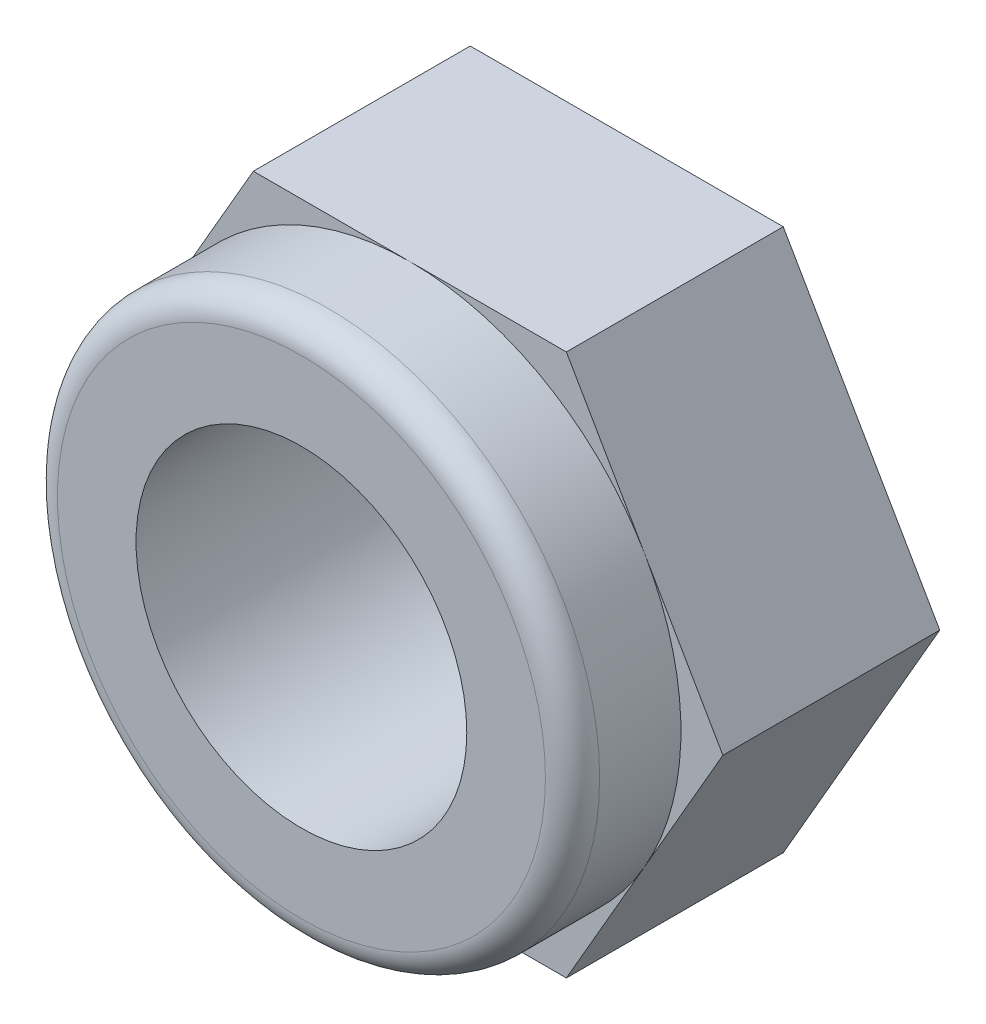
ISO-10303-21;
HEADER;
FILE_DESCRIPTION(('STEP AP214'),'2;1');
FILE_NAME('part.step','',(''),(''),'','','');
FILE_SCHEMA(('AUTOMOTIVE_DESIGN { 1 0 10303 214 1 1 1 1 }'));
ENDSEC;
DATA;
#1=APPLICATION_CONTEXT('core data for automotive mechanical design processes');
#2=APPLICATION_PROTOCOL_DEFINITION('international standard','automotive_design',2000,#1);
#3=PRODUCT_CONTEXT('',#1,'mechanical');
#4=PRODUCT('Part','Part','',(#3));
#5=PRODUCT_RELATED_PRODUCT_CATEGORY('part','',(#4));
#6=PRODUCT_DEFINITION_FORMATION('','',#4);
#7=PRODUCT_DEFINITION_CONTEXT('part definition',#1,'design');
#8=PRODUCT_DEFINITION('design','',#6,#7);
#9=PRODUCT_DEFINITION_SHAPE('','',#8);
#10=(LENGTH_UNIT() NAMED_UNIT(*) SI_UNIT(.MILLI.,.METRE.));
#11=(NAMED_UNIT(*) PLANE_ANGLE_UNIT() SI_UNIT($,.RADIAN.));
#12=(NAMED_UNIT(*) SI_UNIT($,.STERADIAN.) SOLID_ANGLE_UNIT());
#13=UNCERTAINTY_MEASURE_WITH_UNIT(LENGTH_MEASURE(1.E-05),#10,'distance_accuracy_value','');
#14=(GEOMETRIC_REPRESENTATION_CONTEXT(3) GLOBAL_UNCERTAINTY_ASSIGNED_CONTEXT((#13)) GLOBAL_UNIT_ASSIGNED_CONTEXT((#10,
#11,#12)) REPRESENTATION_CONTEXT('',''));
#15=CARTESIAN_POINT('',(0.,0.,0.));
#16=DIRECTION('',(0.,0.,1.));
#17=DIRECTION('',(1.,0.,0.));
#18=AXIS2_PLACEMENT_3D('',#15,#16,#17);
#19=CARTESIAN_POINT('',(0.,0.,4.));
#20=DIRECTION('',(0.,0.,1.));
#21=DIRECTION('',(1.,0.,0.));
#22=AXIS2_PLACEMENT_3D('',#19,#20,#21);
#23=PLANE('',#22);
#24=CARTESIAN_POINT('',(0.,-5.10000000000001,4.));
#25=DIRECTION('',(0.,0.,1.));
#26=DIRECTION('',(1.,0.,0.));
#27=AXIS2_PLACEMENT_3D('',#24,#25,#26);
#28=CIRCLE('',#27,5.);
#29=CARTESIAN_POINT('',(4.33012701892219,-2.60000000000001,4.));
#30=VERTEX_POINT('',#29);
#31=CARTESIAN_POINT('',(0.,-0.100000000000008,4.));
#32=VERTEX_POINT('',#31);
#33=EDGE_CURVE('E139',#30,#32,#28,.T.);
#34=ORIENTED_EDGE('',*,*,#33,.F.);
#35=DIRECTION('',(-0.5,0.866025403784438,0.));
#36=VECTOR('',#35,1.);
#37=CARTESIAN_POINT('',(5.77350269189626,-5.10000000000001,4.));
#38=LINE('',#37,#36);
#39=CARTESIAN_POINT('',(2.88675134594813,-0.100000000000007,4.));
#40=VERTEX_POINT('',#39);
#41=EDGE_CURVE('E127',#30,#40,#38,.T.);
#42=ORIENTED_EDGE('',*,*,#41,.T.);
#43=DIRECTION('',(-1.,0.,0.));
#44=VECTOR('',#43,1.);
#45=CARTESIAN_POINT('',(2.88675134594813,-0.100000000000007,4.));
#46=LINE('',#45,#44);
#47=EDGE_CURVE('E140',#40,#32,#46,.T.);
#48=ORIENTED_EDGE('',*,*,#47,.T.);
#49=EDGE_LOOP('',(#34,#42,#48));
#50=FACE_BOUND('',#49,.T.);
#51=ADVANCED_FACE('F36',(#50),#23,.T.);
#52=CARTESIAN_POINT('',(-4.33012701892219,-2.60000000000001,4.));
#53=VERTEX_POINT('',#52);
#54=EDGE_CURVE('E147',#32,#53,#28,.T.);
#55=ORIENTED_EDGE('',*,*,#54,.F.);
#56=CARTESIAN_POINT('',(-2.88675134594813,-0.100000000000008,4.));
#57=VERTEX_POINT('',#56);
#58=EDGE_CURVE('E167',#32,#57,#46,.T.);
#59=ORIENTED_EDGE('',*,*,#58,.T.);
#60=DIRECTION('',(-0.5,-0.866025403784439,0.));
#61=VECTOR('',#60,1.);
#62=CARTESIAN_POINT('',(-2.88675134594813,-0.100000000000008,4.));
#63=LINE('',#62,#61);
#64=EDGE_CURVE('E168',#57,#53,#63,.T.);
#65=ORIENTED_EDGE('',*,*,#64,.T.);
#66=EDGE_LOOP('',(#55,#59,#65));
#67=FACE_BOUND('',#66,.T.);
#68=ADVANCED_FACE('F271',(#67),#23,.T.);
#69=CARTESIAN_POINT('',(-4.33012701892219,-7.60000000000001,4.));
#70=VERTEX_POINT('',#69);
#71=EDGE_CURVE('E218',#53,#70,#28,.T.);
#72=ORIENTED_EDGE('',*,*,#71,.F.);
#73=CARTESIAN_POINT('',(-5.77350269189626,-5.10000000000001,4.));
#74=VERTEX_POINT('',#73);
#75=EDGE_CURVE('E166',#53,#74,#63,.T.);
#76=ORIENTED_EDGE('',*,*,#75,.T.);
#77=DIRECTION('',(0.5,-0.866025403784438,0.));
#78=VECTOR('',#77,1.);
#79=CARTESIAN_POINT('',(-5.77350269189626,-5.10000000000001,4.));
#80=LINE('',#79,#78);
#81=EDGE_CURVE('E172',#74,#70,#80,.T.);
#82=ORIENTED_EDGE('',*,*,#81,.T.);
#83=EDGE_LOOP('',(#72,#76,#82));
#84=FACE_BOUND('',#83,.T.);
#85=ADVANCED_FACE('F231',(#84),#23,.T.);
#86=CARTESIAN_POINT('',(0.,-10.1,4.));
#87=VERTEX_POINT('',#86);
#88=EDGE_CURVE('E154',#70,#87,#28,.T.);
#89=ORIENTED_EDGE('',*,*,#88,.F.);
#90=CARTESIAN_POINT('',(-2.88675134594813,-10.1,4.));
#91=VERTEX_POINT('',#90);
#92=EDGE_CURVE('E171',#70,#91,#80,.T.);
#93=ORIENTED_EDGE('',*,*,#92,.T.);
#94=DIRECTION('',(1.,0.,0.));
#95=VECTOR('',#94,1.);
#96=CARTESIAN_POINT('',(-2.88675134594813,-10.1,4.));
#97=LINE('',#96,#95);
#98=EDGE_CURVE('E177',#91,#87,#97,.T.);
#99=ORIENTED_EDGE('',*,*,#98,.T.);
#100=EDGE_LOOP('',(#89,#93,#99));
#101=FACE_BOUND('',#100,.T.);
#102=ADVANCED_FACE('F223',(#101),#23,.T.);
#103=CARTESIAN_POINT('',(4.3301270189222,-7.60000000000001,4.));
#104=VERTEX_POINT('',#103);
#105=EDGE_CURVE('E66',#87,#104,#28,.T.);
#106=ORIENTED_EDGE('',*,*,#105,.F.);
#107=CARTESIAN_POINT('',(2.88675134594813,-10.1,4.));
#108=VERTEX_POINT('',#107);
#109=EDGE_CURVE('E176',#87,#108,#97,.T.);
#110=ORIENTED_EDGE('',*,*,#109,.T.);
#111=DIRECTION('',(0.5,0.866025403784439,0.));
#112=VECTOR('',#111,1.);
#113=CARTESIAN_POINT('',(2.88675134594813,-10.1,4.));
#114=LINE('',#113,#112);
#115=EDGE_CURVE('E137',#108,#104,#114,.T.);
#116=ORIENTED_EDGE('',*,*,#115,.T.);
#117=EDGE_LOOP('',(#106,#110,#116));
#118=FACE_BOUND('',#117,.T.);
#119=ADVANCED_FACE('F251',(#118),#23,.T.);
#120=EDGE_CURVE('E55',#104,#30,#28,.T.);
#121=ORIENTED_EDGE('',*,*,#120,.F.);
#122=CARTESIAN_POINT('',(5.77350269189626,-5.10000000000001,4.));
#123=VERTEX_POINT('',#122);
#124=EDGE_CURVE('E121',#104,#123,#114,.T.);
#125=ORIENTED_EDGE('',*,*,#124,.T.);
#126=EDGE_CURVE('E118',#123,#30,#38,.T.);
#127=ORIENTED_EDGE('',*,*,#126,.T.);
#128=EDGE_LOOP('',(#121,#125,#127));
#129=FACE_BOUND('',#128,.T.);
#130=ADVANCED_FACE('F120',(#129),#23,.T.);
#131=CARTESIAN_POINT('',(0.,0.,0.));
#132=DIRECTION('',(0.,0.,1.));
#133=DIRECTION('',(1.,0.,0.));
#134=AXIS2_PLACEMENT_3D('',#131,#132,#133);
#135=PLANE('',#134);
#136=DIRECTION('',(-1.,0.,0.));
#137=VECTOR('',#136,1.);
#138=CARTESIAN_POINT('',(2.88675134594813,-0.100000000000007,0.));
#139=LINE('',#138,#137);
#140=CARTESIAN_POINT('',(2.88675134594813,-0.100000000000007,0.));
#141=VERTEX_POINT('',#140);
#142=CARTESIAN_POINT('',(-2.88675134594813,-0.100000000000008,0.));
#143=VERTEX_POINT('',#142);
#144=EDGE_CURVE('E163',#141,#143,#139,.T.);
#145=ORIENTED_EDGE('',*,*,#144,.F.);
#146=DIRECTION('',(-0.5,0.866025403784438,0.));
#147=VECTOR('',#146,1.);
#148=CARTESIAN_POINT('',(5.77350269189626,-5.10000000000001,0.));
#149=LINE('',#148,#147);
#150=CARTESIAN_POINT('',(5.77350269189626,-5.10000000000001,0.));
#151=VERTEX_POINT('',#150);
#152=EDGE_CURVE('E196',#151,#141,#149,.T.);
#153=ORIENTED_EDGE('',*,*,#152,.F.);
#154=DIRECTION('',(0.5,0.866025403784439,0.));
#155=VECTOR('',#154,1.);
#156=CARTESIAN_POINT('',(2.88675134594813,-10.1,0.));
#157=LINE('',#156,#155);
#158=CARTESIAN_POINT('',(2.88675134594813,-10.1,0.));
#159=VERTEX_POINT('',#158);
#160=EDGE_CURVE('E193',#159,#151,#157,.T.);
#161=ORIENTED_EDGE('',*,*,#160,.F.);
#162=DIRECTION('',(1.,0.,0.));
#163=VECTOR('',#162,1.);
#164=CARTESIAN_POINT('',(-2.88675134594813,-10.1,0.));
#165=LINE('',#164,#163);
#166=CARTESIAN_POINT('',(-2.88675134594813,-10.1,0.));
#167=VERTEX_POINT('',#166);
#168=EDGE_CURVE('E190',#167,#159,#165,.T.);
#169=ORIENTED_EDGE('',*,*,#168,.F.);
#170=DIRECTION('',(0.5,-0.866025403784438,0.));
#171=VECTOR('',#170,1.);
#172=CARTESIAN_POINT('',(-5.77350269189626,-5.10000000000001,0.));
#173=LINE('',#172,#171);
#174=CARTESIAN_POINT('',(-5.77350269189626,-5.10000000000001,0.));
#175=VERTEX_POINT('',#174);
#176=EDGE_CURVE('E187',#175,#167,#173,.T.);
#177=ORIENTED_EDGE('',*,*,#176,.F.);
#178=DIRECTION('',(-0.5,-0.866025403784439,0.));
#179=VECTOR('',#178,1.);
#180=CARTESIAN_POINT('',(-2.88675134594813,-0.100000000000008,0.));
#181=LINE('',#180,#179);
#182=EDGE_CURVE('E185',#143,#175,#181,.T.);
#183=ORIENTED_EDGE('',*,*,#182,.F.);
#184=EDGE_LOOP('',(#145,#153,#161,#169,#177,#183));
#185=FACE_BOUND('',#184,.T.);
#186=CARTESIAN_POINT('',(0.,-5.10000000000001,0.));
#187=DIRECTION('',(0.,0.,1.));
#188=DIRECTION('',(1.,0.,0.));
#189=AXIS2_PLACEMENT_3D('',#186,#187,#188);
#190=CIRCLE('',#189,3.05);
#191=CARTESIAN_POINT('',(3.05,-5.10000000000001,0.));
#192=VERTEX_POINT('',#191);
#193=EDGE_CURVE('E144',#192,#192,#190,.T.);
#194=ORIENTED_EDGE('',*,*,#193,.T.);
#195=EDGE_LOOP('',(#194));
#196=FACE_BOUND('',#195,.T.);
#197=ADVANCED_FACE('F241',(#185,#196),#135,.F.);
#198=CARTESIAN_POINT('',(2.88675134594813,-0.100000000000007,4.));
#199=DIRECTION('',(0.,-1.,0.));
#200=DIRECTION('',(1.,0.,0.));
#201=AXIS2_PLACEMENT_3D('',#198,#199,#200);
#202=PLANE('',#201);
#203=ORIENTED_EDGE('',*,*,#144,.T.);
#204=DIRECTION('',(0.,0.,-1.));
#205=VECTOR('',#204,1.);
#206=CARTESIAN_POINT('',(-2.88675134594813,-0.100000000000008,4.));
#207=LINE('',#206,#205);
#208=EDGE_CURVE('E151',#57,#143,#207,.T.);
#209=ORIENTED_EDGE('',*,*,#208,.F.);
#210=ORIENTED_EDGE('',*,*,#58,.F.);
#211=ORIENTED_EDGE('',*,*,#47,.F.);
#212=DIRECTION('',(0.,0.,-1.));
#213=VECTOR('',#212,1.);
#214=CARTESIAN_POINT('',(2.88675134594813,-0.100000000000007,4.));
#215=LINE('',#214,#213);
#216=EDGE_CURVE('E126',#40,#141,#215,.T.);
#217=ORIENTED_EDGE('',*,*,#216,.T.);
#218=EDGE_LOOP('',(#203,#209,#210,#211,#217));
#219=FACE_BOUND('',#218,.T.);
#220=ADVANCED_FACE('F283',(#219),#202,.F.);
#221=CARTESIAN_POINT('',(-2.88675134594813,-0.100000000000008,4.));
#222=DIRECTION('',(0.866025403784439,-0.5,0.));
#223=DIRECTION('',(0.5,0.866025403784439,0.));
#224=AXIS2_PLACEMENT_3D('',#221,#222,#223);
#225=PLANE('',#224);
#226=ORIENTED_EDGE('',*,*,#182,.T.);
#227=DIRECTION('',(0.,0.,-1.));
#228=VECTOR('',#227,1.);
#229=CARTESIAN_POINT('',(-5.77350269189626,-5.10000000000001,4.));
#230=LINE('',#229,#228);
#231=EDGE_CURVE('E156',#74,#175,#230,.T.);
#232=ORIENTED_EDGE('',*,*,#231,.F.);
#233=ORIENTED_EDGE('',*,*,#75,.F.);
#234=ORIENTED_EDGE('',*,*,#64,.F.);
#235=ORIENTED_EDGE('',*,*,#208,.T.);
#236=EDGE_LOOP('',(#226,#232,#233,#234,#235));
#237=FACE_BOUND('',#236,.T.);
#238=ADVANCED_FACE('F236',(#237),#225,.F.);
#239=CARTESIAN_POINT('',(-5.77350269189626,-5.10000000000001,4.));
#240=DIRECTION('',(0.866025403784439,0.5,0.));
#241=DIRECTION('',(-0.5,0.866025403784438,0.));
#242=AXIS2_PLACEMENT_3D('',#239,#240,#241);
#243=PLANE('',#242);
#244=ORIENTED_EDGE('',*,*,#176,.T.);
#245=DIRECTION('',(0.,0.,-1.));
#246=VECTOR('',#245,1.);
#247=CARTESIAN_POINT('',(-2.88675134594813,-10.1,4.));
#248=LINE('',#247,#246);
#249=EDGE_CURVE('E208',#91,#167,#248,.T.);
#250=ORIENTED_EDGE('',*,*,#249,.F.);
#251=ORIENTED_EDGE('',*,*,#92,.F.);
#252=ORIENTED_EDGE('',*,*,#81,.F.);
#253=ORIENTED_EDGE('',*,*,#231,.T.);
#254=EDGE_LOOP('',(#244,#250,#251,#252,#253));
#255=FACE_BOUND('',#254,.T.);
#256=ADVANCED_FACE('F228',(#255),#243,.F.);
#257=CARTESIAN_POINT('',(-2.88675134594813,-10.1,4.));
#258=DIRECTION('',(0.,1.,0.));
#259=DIRECTION('',(0.,0.,1.));
#260=AXIS2_PLACEMENT_3D('',#257,#258,#259);
#261=PLANE('',#260);
#262=ORIENTED_EDGE('',*,*,#168,.T.);
#263=DIRECTION('',(0.,0.,-1.));
#264=VECTOR('',#263,1.);
#265=CARTESIAN_POINT('',(2.88675134594813,-10.1,4.));
#266=LINE('',#265,#264);
#267=EDGE_CURVE('E204',#108,#159,#266,.T.);
#268=ORIENTED_EDGE('',*,*,#267,.F.);
#269=ORIENTED_EDGE('',*,*,#109,.F.);
#270=ORIENTED_EDGE('',*,*,#98,.F.);
#271=ORIENTED_EDGE('',*,*,#249,.T.);
#272=EDGE_LOOP('',(#262,#268,#269,#270,#271));
#273=FACE_BOUND('',#272,.T.);
#274=ADVANCED_FACE('F247',(#273),#261,.F.);
#275=CARTESIAN_POINT('',(2.88675134594813,-10.1,4.));
#276=DIRECTION('',(-0.866025403784439,0.5,0.));
#277=DIRECTION('',(-0.5,-0.866025403784439,0.));
#278=AXIS2_PLACEMENT_3D('',#275,#276,#277);
#279=PLANE('',#278);
#280=ORIENTED_EDGE('',*,*,#160,.T.);
#281=DIRECTION('',(0.,0.,-1.));
#282=VECTOR('',#281,1.);
#283=CARTESIAN_POINT('',(5.77350269189626,-5.10000000000001,4.));
#284=LINE('',#283,#282);
#285=EDGE_CURVE('E201',#123,#151,#284,.T.);
#286=ORIENTED_EDGE('',*,*,#285,.F.);
#287=ORIENTED_EDGE('',*,*,#124,.F.);
#288=ORIENTED_EDGE('',*,*,#115,.F.);
#289=ORIENTED_EDGE('',*,*,#267,.T.);
#290=EDGE_LOOP('',(#280,#286,#287,#288,#289));
#291=FACE_BOUND('',#290,.T.);
#292=ADVANCED_FACE('F250',(#291),#279,.F.);
#293=CARTESIAN_POINT('',(5.77350269189626,-5.10000000000001,4.));
#294=DIRECTION('',(-0.866025403784439,-0.5,0.));
#295=DIRECTION('',(0.5,-0.866025403784439,0.));
#296=AXIS2_PLACEMENT_3D('',#293,#294,#295);
#297=PLANE('',#296);
#298=ORIENTED_EDGE('',*,*,#152,.T.);
#299=ORIENTED_EDGE('',*,*,#216,.F.);
#300=ORIENTED_EDGE('',*,*,#41,.F.);
#301=ORIENTED_EDGE('',*,*,#126,.F.);
#302=ORIENTED_EDGE('',*,*,#285,.T.);
#303=EDGE_LOOP('',(#298,#299,#300,#301,#302));
#304=FACE_BOUND('',#303,.T.);
#305=ADVANCED_FACE('F131',(#304),#297,.F.);
#306=CARTESIAN_POINT('',(0.,-5.10000000000001,4.));
#307=DIRECTION('',(0.,0.,-1.));
#308=DIRECTION('',(-1.,0.,0.));
#309=AXIS2_PLACEMENT_3D('',#306,#307,#308);
#310=CYLINDRICAL_SURFACE('',#309,3.05);
#311=ORIENTED_EDGE('',*,*,#193,.F.);
#312=EDGE_LOOP('',(#311));
#313=FACE_BOUND('',#312,.T.);
#314=CARTESIAN_POINT('',(0.,-5.10000000000001,6.));
#315=DIRECTION('',(0.,0.,1.));
#316=DIRECTION('',(1.,0.,0.));
#317=AXIS2_PLACEMENT_3D('',#314,#315,#316);
#318=CIRCLE('',#317,3.05);
#319=CARTESIAN_POINT('',(3.05,-5.10000000000001,6.));
#320=VERTEX_POINT('',#319);
#321=EDGE_CURVE('E145',#320,#320,#318,.T.);
#322=ORIENTED_EDGE('',*,*,#321,.T.);
#323=EDGE_LOOP('',(#322));
#324=FACE_BOUND('',#323,.T.);
#325=ADVANCED_FACE('F257',(#313,#324),#310,.F.);
#326=CARTESIAN_POINT('',(0.,-5.10000000000001,6.));
#327=DIRECTION('',(0.,0.,1.));
#328=DIRECTION('',(1.,0.,0.));
#329=AXIS2_PLACEMENT_3D('',#326,#327,#328);
#330=PLANE('',#329);
#331=CARTESIAN_POINT('',(0.,-5.10000000000001,6.));
#332=DIRECTION('',(0.,0.,1.));
#333=DIRECTION('',(1.,0.,0.));
#334=AXIS2_PLACEMENT_3D('',#331,#332,#333);
#335=CIRCLE('',#334,4.5);
#336=CARTESIAN_POINT('',(4.5,-5.10000000000001,6.));
#337=VERTEX_POINT('',#336);
#338=EDGE_CURVE('E45',#337,#337,#335,.T.);
#339=ORIENTED_EDGE('',*,*,#338,.T.);
#340=EDGE_LOOP('',(#339));
#341=FACE_BOUND('',#340,.T.);
#342=ORIENTED_EDGE('',*,*,#321,.F.);
#343=EDGE_LOOP('',(#342));
#344=FACE_BOUND('',#343,.T.);
#345=ADVANCED_FACE('F259',(#341,#344),#330,.T.);
#346=CARTESIAN_POINT('',(0.,-5.10000000000001,6.));
#347=DIRECTION('',(0.,0.,-1.));
#348=DIRECTION('',(-1.,0.,0.));
#349=AXIS2_PLACEMENT_3D('',#346,#347,#348);
#350=CYLINDRICAL_SURFACE('',#349,5.);
#351=CARTESIAN_POINT('',(0.,-5.10000000000001,5.5));
#352=DIRECTION('',(0.,0.,1.));
#353=DIRECTION('',(1.,0.,0.));
#354=AXIS2_PLACEMENT_3D('',#351,#352,#353);
#355=CIRCLE('',#354,5.);
#356=CARTESIAN_POINT('',(5.,-5.10000000000001,5.5));
#357=VERTEX_POINT('',#356);
#358=EDGE_CURVE('E11',#357,#357,#355,.F.);
#359=ORIENTED_EDGE('',*,*,#358,.T.);
#360=EDGE_LOOP('',(#359));
#361=FACE_BOUND('',#360,.T.);
#362=ORIENTED_EDGE('',*,*,#33,.T.);
#363=ORIENTED_EDGE('',*,*,#54,.T.);
#364=ORIENTED_EDGE('',*,*,#71,.T.);
#365=ORIENTED_EDGE('',*,*,#88,.T.);
#366=ORIENTED_EDGE('',*,*,#105,.T.);
#367=ORIENTED_EDGE('',*,*,#120,.T.);
#368=EDGE_LOOP('',(#362,#363,#364,#365,#366,#367));
#369=FACE_BOUND('',#368,.T.);
#370=ADVANCED_FACE('F148',(#361,#369),#350,.T.);
#371=CARTESIAN_POINT('',(0.,-5.10000000000001,5.5));
#372=DIRECTION('',(0.,0.,1.));
#373=DIRECTION('',(1.,0.,0.));
#374=AXIS2_PLACEMENT_3D('',#371,#372,#373);
#375=TOROIDAL_SURFACE('',#374,4.5,0.5);
#376=ORIENTED_EDGE('',*,*,#358,.F.);
#377=EDGE_LOOP('',(#376));
#378=FACE_BOUND('',#377,.T.);
#379=ORIENTED_EDGE('',*,*,#338,.F.);
#380=EDGE_LOOP('',(#379));
#381=FACE_BOUND('',#380,.T.);
#382=ADVANCED_FACE('F38',(#378,#381),#375,.T.);
#383=CLOSED_SHELL('',(#51,#68,#85,#102,#119,#130,#197,#220,#238,#256,#274,#292,#305,#325,#345,
#370,#382));
#384=MANIFOLD_SOLID_BREP('B2',#383);
#385=ADVANCED_BREP_SHAPE_REPRESENTATION('',(#18,#384),#14);
#386=SHAPE_DEFINITION_REPRESENTATION(#9,#385);
ENDSEC;
END-ISO-10303-21;
